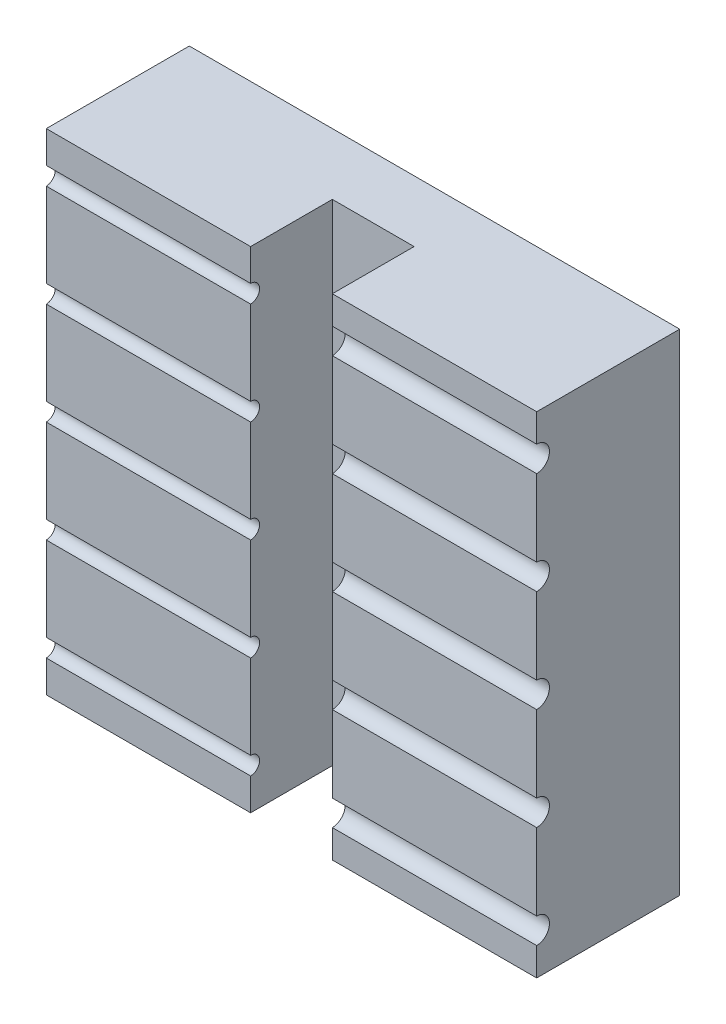
ISO-10303-21;
HEADER;
FILE_DESCRIPTION(('STEP AP214'),'2;1');
FILE_NAME('part.step','',(''),(''),'','','');
FILE_SCHEMA(('AUTOMOTIVE_DESIGN { 1 0 10303 214 1 1 1 1 }'));
ENDSEC;
DATA;
#1=APPLICATION_CONTEXT('core data for automotive mechanical design processes');
#2=APPLICATION_PROTOCOL_DEFINITION('international standard','automotive_design',2000,#1);
#3=PRODUCT_CONTEXT('',#1,'mechanical');
#4=PRODUCT('Part','Part','',(#3));
#5=PRODUCT_RELATED_PRODUCT_CATEGORY('part','',(#4));
#6=PRODUCT_DEFINITION_FORMATION('','',#4);
#7=PRODUCT_DEFINITION_CONTEXT('part definition',#1,'design');
#8=PRODUCT_DEFINITION('design','',#6,#7);
#9=PRODUCT_DEFINITION_SHAPE('','',#8);
#10=(LENGTH_UNIT() NAMED_UNIT(*) SI_UNIT(.MILLI.,.METRE.));
#11=(NAMED_UNIT(*) PLANE_ANGLE_UNIT() SI_UNIT($,.RADIAN.));
#12=(NAMED_UNIT(*) SI_UNIT($,.STERADIAN.) SOLID_ANGLE_UNIT());
#13=UNCERTAINTY_MEASURE_WITH_UNIT(LENGTH_MEASURE(1.E-05),#10,'distance_accuracy_value','');
#14=(GEOMETRIC_REPRESENTATION_CONTEXT(3) GLOBAL_UNCERTAINTY_ASSIGNED_CONTEXT((#13)) GLOBAL_UNIT_ASSIGNED_CONTEXT((#10,
#11,#12)) REPRESENTATION_CONTEXT('',''));
#15=CARTESIAN_POINT('',(0.,0.,0.));
#16=DIRECTION('',(0.,0.,1.));
#17=DIRECTION('',(1.,0.,0.));
#18=AXIS2_PLACEMENT_3D('',#15,#16,#17);
#19=CARTESIAN_POINT('',(0.,0.,14.));
#20=DIRECTION('',(0.,0.,1.));
#21=DIRECTION('',(1.,0.,0.));
#22=AXIS2_PLACEMENT_3D('',#19,#20,#21);
#23=PLANE('',#22);
#24=DIRECTION('',(1.,0.,0.));
#25=VECTOR('',#24,1.);
#26=CARTESIAN_POINT('',(-1.00000000000001,-21.25,14.));
#27=LINE('',#26,#25);
#28=CARTESIAN_POINT('',(4.,-21.25,14.));
#29=VERTEX_POINT('',#28);
#30=CARTESIAN_POINT('',(24.,-21.25,14.));
#31=VERTEX_POINT('',#30);
#32=EDGE_CURVE('E11',#29,#31,#27,.T.);
#33=ORIENTED_EDGE('',*,*,#32,.F.);
#34=DIRECTION('',(0.,1.,0.));
#35=VECTOR('',#34,1.);
#36=CARTESIAN_POINT('',(4.,0.,14.));
#37=LINE('',#36,#35);
#38=CARTESIAN_POINT('',(4.,-24.,14.));
#39=VERTEX_POINT('',#38);
#40=EDGE_CURVE('E391',#39,#29,#37,.T.);
#41=ORIENTED_EDGE('',*,*,#40,.F.);
#42=DIRECTION('',(1.,0.,0.));
#43=VECTOR('',#42,1.);
#44=CARTESIAN_POINT('',(0.,-24.,14.));
#45=LINE('',#44,#43);
#46=CARTESIAN_POINT('',(24.,-24.,14.));
#47=VERTEX_POINT('',#46);
#48=EDGE_CURVE('E260',#39,#47,#45,.T.);
#49=ORIENTED_EDGE('',*,*,#48,.T.);
#50=DIRECTION('',(0.,1.,0.));
#51=VECTOR('',#50,1.);
#52=CARTESIAN_POINT('',(24.,0.,14.));
#53=LINE('',#52,#51);
#54=EDGE_CURVE('E261',#47,#31,#53,.T.);
#55=ORIENTED_EDGE('',*,*,#54,.T.);
#56=EDGE_LOOP('',(#33,#41,#49,#55));
#57=FACE_BOUND('',#56,.T.);
#58=ADVANCED_FACE('F47',(#57),#23,.T.);
#59=DIRECTION('',(1.,0.,0.));
#60=VECTOR('',#59,1.);
#61=CARTESIAN_POINT('',(-1.00000000000001,-1.25,14.));
#62=LINE('',#61,#60);
#63=CARTESIAN_POINT('',(4.,-1.25,14.));
#64=VERTEX_POINT('',#63);
#65=CARTESIAN_POINT('',(24.,-1.25,14.));
#66=VERTEX_POINT('',#65);
#67=EDGE_CURVE('E370',#64,#66,#62,.T.);
#68=ORIENTED_EDGE('',*,*,#67,.F.);
#69=CARTESIAN_POINT('',(4.,-8.75,14.));
#70=VERTEX_POINT('',#69);
#71=EDGE_CURVE('E399',#70,#64,#37,.T.);
#72=ORIENTED_EDGE('',*,*,#71,.F.);
#73=DIRECTION('',(1.,0.,0.));
#74=VECTOR('',#73,1.);
#75=CARTESIAN_POINT('',(-1.00000000000001,-8.75,14.));
#76=LINE('',#75,#74);
#77=CARTESIAN_POINT('',(24.,-8.75,14.));
#78=VERTEX_POINT('',#77);
#79=EDGE_CURVE('E361',#78,#70,#76,.F.);
#80=ORIENTED_EDGE('',*,*,#79,.F.);
#81=EDGE_CURVE('E259',#78,#66,#53,.T.);
#82=ORIENTED_EDGE('',*,*,#81,.T.);
#83=EDGE_LOOP('',(#68,#72,#80,#82));
#84=FACE_BOUND('',#83,.T.);
#85=ADVANCED_FACE('F506',(#84),#23,.T.);
#86=DIRECTION('',(1.,0.,0.));
#87=VECTOR('',#86,1.);
#88=CARTESIAN_POINT('',(-1.00000000000001,-18.75,14.));
#89=LINE('',#88,#87);
#90=CARTESIAN_POINT('',(24.,-18.75,14.));
#91=VERTEX_POINT('',#90);
#92=CARTESIAN_POINT('',(4.,-18.75,14.));
#93=VERTEX_POINT('',#92);
#94=EDGE_CURVE('E56',#91,#93,#89,.F.);
#95=ORIENTED_EDGE('',*,*,#94,.F.);
#96=CARTESIAN_POINT('',(24.,-11.25,14.));
#97=VERTEX_POINT('',#96);
#98=EDGE_CURVE('E267',#91,#97,#53,.T.);
#99=ORIENTED_EDGE('',*,*,#98,.T.);
#100=DIRECTION('',(1.,0.,0.));
#101=VECTOR('',#100,1.);
#102=CARTESIAN_POINT('',(-1.00000000000001,-11.25,14.));
#103=LINE('',#102,#101);
#104=CARTESIAN_POINT('',(4.,-11.25,14.));
#105=VERTEX_POINT('',#104);
#106=EDGE_CURVE('E364',#105,#97,#103,.T.);
#107=ORIENTED_EDGE('',*,*,#106,.F.);
#108=EDGE_CURVE('E389',#93,#105,#37,.T.);
#109=ORIENTED_EDGE('',*,*,#108,.F.);
#110=EDGE_LOOP('',(#95,#99,#107,#109));
#111=FACE_BOUND('',#110,.T.);
#112=ADVANCED_FACE('F397',(#111),#23,.T.);
#113=DIRECTION('',(1.,0.,0.));
#114=VECTOR('',#113,1.);
#115=CARTESIAN_POINT('',(-1.00000000000001,1.25,14.));
#116=LINE('',#115,#114);
#117=CARTESIAN_POINT('',(24.,1.25,14.));
#118=VERTEX_POINT('',#117);
#119=CARTESIAN_POINT('',(4.,1.25,14.));
#120=VERTEX_POINT('',#119);
#121=EDGE_CURVE('E367',#118,#120,#116,.F.);
#122=ORIENTED_EDGE('',*,*,#121,.F.);
#123=CARTESIAN_POINT('',(24.,8.75,14.));
#124=VERTEX_POINT('',#123);
#125=EDGE_CURVE('E254',#118,#124,#53,.T.);
#126=ORIENTED_EDGE('',*,*,#125,.T.);
#127=DIRECTION('',(1.,0.,0.));
#128=VECTOR('',#127,1.);
#129=CARTESIAN_POINT('',(-1.00000000000001,8.75,14.));
#130=LINE('',#129,#128);
#131=CARTESIAN_POINT('',(4.,8.75,14.));
#132=VERTEX_POINT('',#131);
#133=EDGE_CURVE('E358',#132,#124,#130,.T.);
#134=ORIENTED_EDGE('',*,*,#133,.F.);
#135=EDGE_CURVE('E404',#120,#132,#37,.T.);
#136=ORIENTED_EDGE('',*,*,#135,.F.);
#137=EDGE_LOOP('',(#122,#126,#134,#136));
#138=FACE_BOUND('',#137,.T.);
#139=ADVANCED_FACE('F495',(#138),#23,.T.);
#140=DIRECTION('',(1.,0.,0.));
#141=VECTOR('',#140,1.);
#142=CARTESIAN_POINT('',(-1.00000000000001,11.25,14.));
#143=LINE('',#142,#141);
#144=CARTESIAN_POINT('',(24.,11.25,14.));
#145=VERTEX_POINT('',#144);
#146=CARTESIAN_POINT('',(4.,11.25,14.));
#147=VERTEX_POINT('',#146);
#148=EDGE_CURVE('E239',#145,#147,#143,.F.);
#149=ORIENTED_EDGE('',*,*,#148,.F.);
#150=CARTESIAN_POINT('',(24.,18.75,14.));
#151=VERTEX_POINT('',#150);
#152=EDGE_CURVE('E247',#145,#151,#53,.T.);
#153=ORIENTED_EDGE('',*,*,#152,.T.);
#154=DIRECTION('',(1.,0.,0.));
#155=VECTOR('',#154,1.);
#156=CARTESIAN_POINT('',(-1.00000000000001,18.75,14.));
#157=LINE('',#156,#155);
#158=CARTESIAN_POINT('',(4.,18.75,14.));
#159=VERTEX_POINT('',#158);
#160=EDGE_CURVE('E230',#159,#151,#157,.T.);
#161=ORIENTED_EDGE('',*,*,#160,.F.);
#162=EDGE_CURVE('E486',#147,#159,#37,.T.);
#163=ORIENTED_EDGE('',*,*,#162,.F.);
#164=EDGE_LOOP('',(#149,#153,#161,#163));
#165=FACE_BOUND('',#164,.T.);
#166=ADVANCED_FACE('F252',(#165),#23,.T.);
#167=CARTESIAN_POINT('',(0.,0.,14.));
#168=DIRECTION('',(0.,0.,1.));
#169=DIRECTION('',(1.,0.,0.));
#170=AXIS2_PLACEMENT_3D('',#167,#168,#169);
#171=PLANE('',#170);
#172=DIRECTION('',(-1.,0.,0.));
#173=VECTOR('',#172,1.);
#174=CARTESIAN_POINT('',(1.00000000000001,-19.125,14.));
#175=LINE('',#174,#173);
#176=CARTESIAN_POINT('',(-4.,-19.125,14.));
#177=VERTEX_POINT('',#176);
#178=CARTESIAN_POINT('',(-24.,-19.125,14.));
#179=VERTEX_POINT('',#178);
#180=EDGE_CURVE('E351',#177,#179,#175,.T.);
#181=ORIENTED_EDGE('',*,*,#180,.F.);
#182=DIRECTION('',(0.,1.,0.));
#183=VECTOR('',#182,1.);
#184=CARTESIAN_POINT('',(-4.,0.,14.));
#185=LINE('',#184,#183);
#186=CARTESIAN_POINT('',(-4.,-10.875,14.));
#187=VERTEX_POINT('',#186);
#188=EDGE_CURVE('E426',#177,#187,#185,.T.);
#189=ORIENTED_EDGE('',*,*,#188,.T.);
#190=DIRECTION('',(-1.,0.,0.));
#191=VECTOR('',#190,1.);
#192=CARTESIAN_POINT('',(1.00000000000001,-10.875,14.));
#193=LINE('',#192,#191);
#194=CARTESIAN_POINT('',(-24.,-10.875,14.));
#195=VERTEX_POINT('',#194);
#196=EDGE_CURVE('E342',#195,#187,#193,.F.);
#197=ORIENTED_EDGE('',*,*,#196,.F.);
#198=DIRECTION('',(0.,1.,0.));
#199=VECTOR('',#198,1.);
#200=CARTESIAN_POINT('',(-24.,0.,14.));
#201=LINE('',#200,#199);
#202=EDGE_CURVE('E416',#179,#195,#201,.T.);
#203=ORIENTED_EDGE('',*,*,#202,.F.);
#204=EDGE_LOOP('',(#181,#189,#197,#203));
#205=FACE_BOUND('',#204,.T.);
#206=ADVANCED_FACE('F544',(#205),#171,.T.);
#207=DIRECTION('',(-1.,0.,0.));
#208=VECTOR('',#207,1.);
#209=CARTESIAN_POINT('',(1.00000000000001,-9.125,14.));
#210=LINE('',#209,#208);
#211=CARTESIAN_POINT('',(-4.,-9.125,14.));
#212=VERTEX_POINT('',#211);
#213=CARTESIAN_POINT('',(-24.,-9.125,14.));
#214=VERTEX_POINT('',#213);
#215=EDGE_CURVE('E345',#212,#214,#210,.T.);
#216=ORIENTED_EDGE('',*,*,#215,.F.);
#217=CARTESIAN_POINT('',(-4.,-0.875,14.));
#218=VERTEX_POINT('',#217);
#219=EDGE_CURVE('E657',#212,#218,#185,.T.);
#220=ORIENTED_EDGE('',*,*,#219,.T.);
#221=DIRECTION('',(-1.,0.,0.));
#222=VECTOR('',#221,1.);
#223=CARTESIAN_POINT('',(1.00000000000001,-0.875,14.));
#224=LINE('',#223,#222);
#225=CARTESIAN_POINT('',(-24.,-0.875,14.));
#226=VERTEX_POINT('',#225);
#227=EDGE_CURVE('E336',#226,#218,#224,.F.);
#228=ORIENTED_EDGE('',*,*,#227,.F.);
#229=EDGE_CURVE('E677',#214,#226,#201,.T.);
#230=ORIENTED_EDGE('',*,*,#229,.F.);
#231=EDGE_LOOP('',(#216,#220,#228,#230));
#232=FACE_BOUND('',#231,.T.);
#233=ADVANCED_FACE('F550',(#232),#171,.T.);
#234=DIRECTION('',(-1.,0.,0.));
#235=VECTOR('',#234,1.);
#236=CARTESIAN_POINT('',(1.00000000000001,0.875,14.));
#237=LINE('',#236,#235);
#238=CARTESIAN_POINT('',(-4.,0.875,14.));
#239=VERTEX_POINT('',#238);
#240=CARTESIAN_POINT('',(-24.,0.875,14.));
#241=VERTEX_POINT('',#240);
#242=EDGE_CURVE('E339',#239,#241,#237,.T.);
#243=ORIENTED_EDGE('',*,*,#242,.F.);
#244=CARTESIAN_POINT('',(-4.,9.125,14.));
#245=VERTEX_POINT('',#244);
#246=EDGE_CURVE('E652',#239,#245,#185,.T.);
#247=ORIENTED_EDGE('',*,*,#246,.T.);
#248=DIRECTION('',(-1.,0.,0.));
#249=VECTOR('',#248,1.);
#250=CARTESIAN_POINT('',(1.00000000000001,9.125,14.));
#251=LINE('',#250,#249);
#252=CARTESIAN_POINT('',(-24.,9.125,14.));
#253=VERTEX_POINT('',#252);
#254=EDGE_CURVE('E330',#253,#245,#251,.F.);
#255=ORIENTED_EDGE('',*,*,#254,.F.);
#256=EDGE_CURVE('E681',#241,#253,#201,.T.);
#257=ORIENTED_EDGE('',*,*,#256,.F.);
#258=EDGE_LOOP('',(#243,#247,#255,#257));
#259=FACE_BOUND('',#258,.T.);
#260=ADVANCED_FACE('F638',(#259),#171,.T.);
#261=DIRECTION('',(-1.,0.,0.));
#262=VECTOR('',#261,1.);
#263=CARTESIAN_POINT('',(1.00000000000001,10.875,14.));
#264=LINE('',#263,#262);
#265=CARTESIAN_POINT('',(-4.,10.875,14.));
#266=VERTEX_POINT('',#265);
#267=CARTESIAN_POINT('',(-24.,10.875,14.));
#268=VERTEX_POINT('',#267);
#269=EDGE_CURVE('E333',#266,#268,#264,.T.);
#270=ORIENTED_EDGE('',*,*,#269,.F.);
#271=CARTESIAN_POINT('',(-4.,19.125,14.));
#272=VERTEX_POINT('',#271);
#273=EDGE_CURVE('E650',#266,#272,#185,.T.);
#274=ORIENTED_EDGE('',*,*,#273,.T.);
#275=DIRECTION('',(-1.,0.,0.));
#276=VECTOR('',#275,1.);
#277=CARTESIAN_POINT('',(1.00000000000001,19.125,14.));
#278=LINE('',#277,#276);
#279=CARTESIAN_POINT('',(-24.,19.125,14.));
#280=VERTEX_POINT('',#279);
#281=EDGE_CURVE('E324',#280,#272,#278,.F.);
#282=ORIENTED_EDGE('',*,*,#281,.F.);
#283=EDGE_CURVE('E685',#268,#280,#201,.T.);
#284=ORIENTED_EDGE('',*,*,#283,.F.);
#285=EDGE_LOOP('',(#270,#274,#282,#284));
#286=FACE_BOUND('',#285,.T.);
#287=ADVANCED_FACE('F629',(#286),#171,.T.);
#288=DIRECTION('',(-1.,0.,0.));
#289=VECTOR('',#288,1.);
#290=CARTESIAN_POINT('',(1.00000000000001,20.875,14.));
#291=LINE('',#290,#289);
#292=CARTESIAN_POINT('',(-4.,20.875,14.));
#293=VERTEX_POINT('',#292);
#294=CARTESIAN_POINT('',(-24.,20.875,14.));
#295=VERTEX_POINT('',#294);
#296=EDGE_CURVE('E327',#293,#295,#291,.T.);
#297=ORIENTED_EDGE('',*,*,#296,.F.);
#298=CARTESIAN_POINT('',(-4.,24.,14.));
#299=VERTEX_POINT('',#298);
#300=EDGE_CURVE('E427',#293,#299,#185,.T.);
#301=ORIENTED_EDGE('',*,*,#300,.T.);
#302=DIRECTION('',(1.,0.,0.));
#303=VECTOR('',#302,1.);
#304=CARTESIAN_POINT('',(0.,24.,14.));
#305=LINE('',#304,#303);
#306=CARTESIAN_POINT('',(-24.,24.,14.));
#307=VERTEX_POINT('',#306);
#308=EDGE_CURVE('E418',#307,#299,#305,.T.);
#309=ORIENTED_EDGE('',*,*,#308,.F.);
#310=EDGE_CURVE('E417',#295,#307,#201,.T.);
#311=ORIENTED_EDGE('',*,*,#310,.F.);
#312=EDGE_LOOP('',(#297,#301,#309,#311));
#313=FACE_BOUND('',#312,.T.);
#314=ADVANCED_FACE('F623',(#313),#171,.T.);
#315=CARTESIAN_POINT('',(0.,0.,6.));
#316=DIRECTION('',(0.,0.,1.));
#317=DIRECTION('',(1.,0.,0.));
#318=AXIS2_PLACEMENT_3D('',#315,#316,#317);
#319=PLANE('',#318);
#320=DIRECTION('',(1.,0.,0.));
#321=VECTOR('',#320,1.);
#322=CARTESIAN_POINT('',(0.,24.,6.));
#323=LINE('',#322,#321);
#324=CARTESIAN_POINT('',(-4.,24.,6.));
#325=VERTEX_POINT('',#324);
#326=CARTESIAN_POINT('',(4.,24.,6.));
#327=VERTEX_POINT('',#326);
#328=EDGE_CURVE('E293',#325,#327,#323,.T.);
#329=ORIENTED_EDGE('',*,*,#328,.F.);
#330=DIRECTION('',(0.,-1.,0.));
#331=VECTOR('',#330,1.);
#332=CARTESIAN_POINT('',(-4.,0.,6.));
#333=LINE('',#332,#331);
#334=CARTESIAN_POINT('',(-4.,-24.,6.));
#335=VERTEX_POINT('',#334);
#336=EDGE_CURVE('E283',#325,#335,#333,.T.);
#337=ORIENTED_EDGE('',*,*,#336,.T.);
#338=DIRECTION('',(1.,0.,0.));
#339=VECTOR('',#338,1.);
#340=CARTESIAN_POINT('',(0.,-24.,6.));
#341=LINE('',#340,#339);
#342=CARTESIAN_POINT('',(4.,-24.,6.));
#343=VERTEX_POINT('',#342);
#344=EDGE_CURVE('E289',#335,#343,#341,.T.);
#345=ORIENTED_EDGE('',*,*,#344,.T.);
#346=DIRECTION('',(0.,-1.,0.));
#347=VECTOR('',#346,1.);
#348=CARTESIAN_POINT('',(4.,0.,6.));
#349=LINE('',#348,#347);
#350=EDGE_CURVE('E280',#327,#343,#349,.T.);
#351=ORIENTED_EDGE('',*,*,#350,.F.);
#352=EDGE_LOOP('',(#329,#337,#345,#351));
#353=FACE_BOUND('',#352,.T.);
#354=ADVANCED_FACE('F628',(#353),#319,.T.);
#355=CARTESIAN_POINT('',(0.,-24.,6.));
#356=DIRECTION('',(0.,1.,0.));
#357=DIRECTION('',(0.,0.,1.));
#358=AXIS2_PLACEMENT_3D('',#355,#356,#357);
#359=PLANE('',#358);
#360=DIRECTION('',(1.,0.,0.));
#361=VECTOR('',#360,1.);
#362=CARTESIAN_POINT('',(0.,-24.,0.));
#363=LINE('',#362,#361);
#364=CARTESIAN_POINT('',(-24.,-24.,0.));
#365=VERTEX_POINT('',#364);
#366=CARTESIAN_POINT('',(24.,-24.,0.));
#367=VERTEX_POINT('',#366);
#368=EDGE_CURVE('E288',#365,#367,#363,.T.);
#369=ORIENTED_EDGE('',*,*,#368,.T.);
#370=DIRECTION('',(0.,0.,-1.));
#371=VECTOR('',#370,1.);
#372=CARTESIAN_POINT('',(24.,-24.,6.));
#373=LINE('',#372,#371);
#374=EDGE_CURVE('E320',#47,#367,#373,.T.);
#375=ORIENTED_EDGE('',*,*,#374,.F.);
#376=ORIENTED_EDGE('',*,*,#48,.F.);
#377=DIRECTION('',(0.,0.,-1.));
#378=VECTOR('',#377,1.);
#379=CARTESIAN_POINT('',(4.,-24.,14.));
#380=LINE('',#379,#378);
#381=EDGE_CURVE('E275',#39,#343,#380,.T.);
#382=ORIENTED_EDGE('',*,*,#381,.T.);
#383=ORIENTED_EDGE('',*,*,#344,.F.);
#384=DIRECTION('',(0.,0.,-1.));
#385=VECTOR('',#384,1.);
#386=CARTESIAN_POINT('',(-4.,-24.,14.));
#387=LINE('',#386,#385);
#388=CARTESIAN_POINT('',(-4.,-24.,14.));
#389=VERTEX_POINT('',#388);
#390=EDGE_CURVE('E284',#389,#335,#387,.T.);
#391=ORIENTED_EDGE('',*,*,#390,.F.);
#392=DIRECTION('',(1.,0.,0.));
#393=VECTOR('',#392,1.);
#394=CARTESIAN_POINT('',(0.,-24.,14.));
#395=LINE('',#394,#393);
#396=CARTESIAN_POINT('',(-24.,-24.,14.));
#397=VERTEX_POINT('',#396);
#398=EDGE_CURVE('E279',#397,#389,#395,.T.);
#399=ORIENTED_EDGE('',*,*,#398,.F.);
#400=DIRECTION('',(0.,0.,-1.));
#401=VECTOR('',#400,1.);
#402=CARTESIAN_POINT('',(-24.,-24.,6.));
#403=LINE('',#402,#401);
#404=EDGE_CURVE('E298',#397,#365,#403,.T.);
#405=ORIENTED_EDGE('',*,*,#404,.T.);
#406=EDGE_LOOP('',(#369,#375,#376,#382,#383,#391,#399,#405));
#407=FACE_BOUND('',#406,.T.);
#408=ADVANCED_FACE('F49',(#407),#359,.F.);
#409=CARTESIAN_POINT('',(24.,0.,6.));
#410=DIRECTION('',(-1.,0.,0.));
#411=DIRECTION('',(0.,0.,1.));
#412=AXIS2_PLACEMENT_3D('',#409,#410,#411);
#413=PLANE('',#412);
#414=ORIENTED_EDGE('',*,*,#98,.F.);
#415=CARTESIAN_POINT('',(24.,-20.,14.));
#416=DIRECTION('',(1.,0.,0.));
#417=DIRECTION('',(0.,0.,-1.));
#418=AXIS2_PLACEMENT_3D('',#415,#416,#417);
#419=CIRCLE('',#418,1.25);
#420=EDGE_CURVE('E380',#31,#91,#419,.T.);
#421=ORIENTED_EDGE('',*,*,#420,.F.);
#422=ORIENTED_EDGE('',*,*,#54,.F.);
#423=ORIENTED_EDGE('',*,*,#374,.T.);
#424=DIRECTION('',(0.,1.,0.));
#425=VECTOR('',#424,1.);
#426=CARTESIAN_POINT('',(24.,0.,0.));
#427=LINE('',#426,#425);
#428=CARTESIAN_POINT('',(24.,24.,0.));
#429=VERTEX_POINT('',#428);
#430=EDGE_CURVE('E301',#367,#429,#427,.T.);
#431=ORIENTED_EDGE('',*,*,#430,.T.);
#432=DIRECTION('',(0.,0.,-1.));
#433=VECTOR('',#432,1.);
#434=CARTESIAN_POINT('',(24.,24.,6.));
#435=LINE('',#434,#433);
#436=CARTESIAN_POINT('',(24.,24.,14.));
#437=VERTEX_POINT('',#436);
#438=EDGE_CURVE('E316',#437,#429,#435,.T.);
#439=ORIENTED_EDGE('',*,*,#438,.F.);
#440=CARTESIAN_POINT('',(24.,21.25,14.));
#441=VERTEX_POINT('',#440);
#442=EDGE_CURVE('E249',#441,#437,#53,.T.);
#443=ORIENTED_EDGE('',*,*,#442,.F.);
#444=CARTESIAN_POINT('',(24.,20.,14.0000000000001));
#445=DIRECTION('',(1.,0.,0.));
#446=DIRECTION('',(0.,0.,-1.));
#447=AXIS2_PLACEMENT_3D('',#444,#445,#446);
#448=CIRCLE('',#447,1.25);
#449=EDGE_CURVE('E63',#151,#441,#448,.T.);
#450=ORIENTED_EDGE('',*,*,#449,.F.);
#451=ORIENTED_EDGE('',*,*,#152,.F.);
#452=CARTESIAN_POINT('',(24.,10.,14.0000000000001));
#453=DIRECTION('',(1.,0.,0.));
#454=DIRECTION('',(0.,0.,-1.));
#455=AXIS2_PLACEMENT_3D('',#452,#453,#454);
#456=CIRCLE('',#455,1.25);
#457=EDGE_CURVE('E71',#124,#145,#456,.T.);
#458=ORIENTED_EDGE('',*,*,#457,.F.);
#459=ORIENTED_EDGE('',*,*,#125,.F.);
#460=CARTESIAN_POINT('',(24.,0.,14.));
#461=DIRECTION('',(1.,0.,0.));
#462=DIRECTION('',(0.,0.,-1.));
#463=AXIS2_PLACEMENT_3D('',#460,#461,#462);
#464=CIRCLE('',#463,1.25);
#465=EDGE_CURVE('E480',#66,#118,#464,.T.);
#466=ORIENTED_EDGE('',*,*,#465,.F.);
#467=ORIENTED_EDGE('',*,*,#81,.F.);
#468=CARTESIAN_POINT('',(24.,-10.,14.));
#469=DIRECTION('',(1.,0.,0.));
#470=DIRECTION('',(0.,0.,-1.));
#471=AXIS2_PLACEMENT_3D('',#468,#469,#470);
#472=CIRCLE('',#471,1.25);
#473=EDGE_CURVE('E477',#97,#78,#472,.T.);
#474=ORIENTED_EDGE('',*,*,#473,.F.);
#475=EDGE_LOOP('',(#414,#421,#422,#423,#431,#439,#443,#450,#451,#458,#459,#466,#467,#474));
#476=FACE_BOUND('',#475,.T.);
#477=ADVANCED_FACE('F246',(#476),#413,.F.);
#478=CARTESIAN_POINT('',(0.,24.,6.));
#479=DIRECTION('',(0.,1.,0.));
#480=DIRECTION('',(0.,0.,1.));
#481=AXIS2_PLACEMENT_3D('',#478,#479,#480);
#482=PLANE('',#481);
#483=DIRECTION('',(0.,0.,-1.));
#484=VECTOR('',#483,1.);
#485=CARTESIAN_POINT('',(-4.,24.,14.));
#486=LINE('',#485,#484);
#487=EDGE_CURVE('E408',#299,#325,#486,.T.);
#488=ORIENTED_EDGE('',*,*,#487,.T.);
#489=ORIENTED_EDGE('',*,*,#328,.T.);
#490=DIRECTION('',(0.,0.,-1.));
#491=VECTOR('',#490,1.);
#492=CARTESIAN_POINT('',(4.,24.,14.));
#493=LINE('',#492,#491);
#494=CARTESIAN_POINT('',(4.,24.,14.));
#495=VERTEX_POINT('',#494);
#496=EDGE_CURVE('E272',#495,#327,#493,.T.);
#497=ORIENTED_EDGE('',*,*,#496,.F.);
#498=DIRECTION('',(1.,0.,0.));
#499=VECTOR('',#498,1.);
#500=CARTESIAN_POINT('',(0.,24.,14.));
#501=LINE('',#500,#499);
#502=EDGE_CURVE('E266',#495,#437,#501,.T.);
#503=ORIENTED_EDGE('',*,*,#502,.T.);
#504=ORIENTED_EDGE('',*,*,#438,.T.);
#505=DIRECTION('',(1.,0.,0.));
#506=VECTOR('',#505,1.);
#507=CARTESIAN_POINT('',(0.,24.,0.));
#508=LINE('',#507,#506);
#509=CARTESIAN_POINT('',(-24.,24.,0.));
#510=VERTEX_POINT('',#509);
#511=EDGE_CURVE('E305',#510,#429,#508,.T.);
#512=ORIENTED_EDGE('',*,*,#511,.F.);
#513=DIRECTION('',(0.,0.,-1.));
#514=VECTOR('',#513,1.);
#515=CARTESIAN_POINT('',(-24.,24.,6.));
#516=LINE('',#515,#514);
#517=EDGE_CURVE('E313',#307,#510,#516,.T.);
#518=ORIENTED_EDGE('',*,*,#517,.F.);
#519=ORIENTED_EDGE('',*,*,#308,.T.);
#520=EDGE_LOOP('',(#488,#489,#497,#503,#504,#512,#518,#519));
#521=FACE_BOUND('',#520,.T.);
#522=ADVANCED_FACE('F698',(#521),#482,.T.);
#523=CARTESIAN_POINT('',(-24.,0.,6.));
#524=DIRECTION('',(-1.,0.,0.));
#525=DIRECTION('',(0.,0.,1.));
#526=AXIS2_PLACEMENT_3D('',#523,#524,#525);
#527=PLANE('',#526);
#528=CARTESIAN_POINT('',(-24.,-20.,14.));
#529=DIRECTION('',(-1.,0.,0.));
#530=DIRECTION('',(0.,0.,1.));
#531=AXIS2_PLACEMENT_3D('',#528,#529,#530);
#532=CIRCLE('',#531,0.875);
#533=CARTESIAN_POINT('',(-24.,-20.875,14.));
#534=VERTEX_POINT('',#533);
#535=EDGE_CURVE('E451',#179,#534,#532,.T.);
#536=ORIENTED_EDGE('',*,*,#535,.F.);
#537=ORIENTED_EDGE('',*,*,#202,.T.);
#538=CARTESIAN_POINT('',(-24.,-10.,14.));
#539=DIRECTION('',(-1.,0.,0.));
#540=DIRECTION('',(0.,0.,1.));
#541=AXIS2_PLACEMENT_3D('',#538,#539,#540);
#542=CIRCLE('',#541,0.875);
#543=EDGE_CURVE('E460',#214,#195,#542,.T.);
#544=ORIENTED_EDGE('',*,*,#543,.F.);
#545=ORIENTED_EDGE('',*,*,#229,.T.);
#546=CARTESIAN_POINT('',(-24.,0.,14.));
#547=DIRECTION('',(-1.,0.,0.));
#548=DIRECTION('',(0.,0.,1.));
#549=AXIS2_PLACEMENT_3D('',#546,#547,#548);
#550=CIRCLE('',#549,0.875);
#551=EDGE_CURVE('E457',#241,#226,#550,.T.);
#552=ORIENTED_EDGE('',*,*,#551,.F.);
#553=ORIENTED_EDGE('',*,*,#256,.T.);
#554=CARTESIAN_POINT('',(-24.,10.,14.));
#555=DIRECTION('',(-1.,0.,0.));
#556=DIRECTION('',(0.,0.,1.));
#557=AXIS2_PLACEMENT_3D('',#554,#555,#556);
#558=CIRCLE('',#557,0.875);
#559=EDGE_CURVE('E454',#268,#253,#558,.T.);
#560=ORIENTED_EDGE('',*,*,#559,.F.);
#561=ORIENTED_EDGE('',*,*,#283,.T.);
#562=CARTESIAN_POINT('',(-24.,20.,14.));
#563=DIRECTION('',(-1.,0.,0.));
#564=DIRECTION('',(0.,0.,1.));
#565=AXIS2_PLACEMENT_3D('',#562,#563,#564);
#566=CIRCLE('',#565,0.875);
#567=EDGE_CURVE('E393',#295,#280,#566,.T.);
#568=ORIENTED_EDGE('',*,*,#567,.F.);
#569=ORIENTED_EDGE('',*,*,#310,.T.);
#570=ORIENTED_EDGE('',*,*,#517,.T.);
#571=DIRECTION('',(0.,1.,0.));
#572=VECTOR('',#571,1.);
#573=CARTESIAN_POINT('',(-24.,0.,0.));
#574=LINE('',#573,#572);
#575=EDGE_CURVE('E294',#365,#510,#574,.T.);
#576=ORIENTED_EDGE('',*,*,#575,.F.);
#577=ORIENTED_EDGE('',*,*,#404,.F.);
#578=EDGE_CURVE('E412',#397,#534,#201,.T.);
#579=ORIENTED_EDGE('',*,*,#578,.T.);
#580=EDGE_LOOP('',(#536,#537,#544,#545,#552,#553,#560,#561,#568,#569,#570,#576,#577,#579));
#581=FACE_BOUND('',#580,.T.);
#582=ADVANCED_FACE('F694',(#581),#527,.T.);
#583=CARTESIAN_POINT('',(0.,0.,0.));
#584=DIRECTION('',(0.,0.,1.));
#585=DIRECTION('',(1.,0.,0.));
#586=AXIS2_PLACEMENT_3D('',#583,#584,#585);
#587=PLANE('',#586);
#588=ORIENTED_EDGE('',*,*,#511,.T.);
#589=ORIENTED_EDGE('',*,*,#430,.F.);
#590=ORIENTED_EDGE('',*,*,#368,.F.);
#591=ORIENTED_EDGE('',*,*,#575,.T.);
#592=EDGE_LOOP('',(#588,#589,#590,#591));
#593=FACE_BOUND('',#592,.T.);
#594=ADVANCED_FACE('F542',(#593),#587,.F.);
#595=CARTESIAN_POINT('',(4.,0.,14.));
#596=DIRECTION('',(-1.,0.,0.));
#597=DIRECTION('',(0.,0.,1.));
#598=AXIS2_PLACEMENT_3D('',#595,#596,#597);
#599=PLANE('',#598);
#600=CARTESIAN_POINT('',(4.,-20.,14.));
#601=DIRECTION('',(-1.,0.,0.));
#602=DIRECTION('',(0.,0.,1.));
#603=AXIS2_PLACEMENT_3D('',#600,#601,#602);
#604=CIRCLE('',#603,1.25);
#605=EDGE_CURVE('E377',#93,#29,#604,.T.);
#606=ORIENTED_EDGE('',*,*,#605,.F.);
#607=ORIENTED_EDGE('',*,*,#108,.T.);
#608=CARTESIAN_POINT('',(4.,-10.,14.));
#609=DIRECTION('',(-1.,0.,0.));
#610=DIRECTION('',(0.,0.,1.));
#611=AXIS2_PLACEMENT_3D('',#608,#609,#610);
#612=CIRCLE('',#611,1.25);
#613=EDGE_CURVE('E467',#70,#105,#612,.T.);
#614=ORIENTED_EDGE('',*,*,#613,.F.);
#615=ORIENTED_EDGE('',*,*,#71,.T.);
#616=CARTESIAN_POINT('',(4.,0.,14.));
#617=DIRECTION('',(-1.,0.,0.));
#618=DIRECTION('',(0.,0.,1.));
#619=AXIS2_PLACEMENT_3D('',#616,#617,#618);
#620=CIRCLE('',#619,1.25);
#621=EDGE_CURVE('E394',#120,#64,#620,.T.);
#622=ORIENTED_EDGE('',*,*,#621,.F.);
#623=ORIENTED_EDGE('',*,*,#135,.T.);
#624=CARTESIAN_POINT('',(4.,10.,14.0000000000001));
#625=DIRECTION('',(-1.,0.,0.));
#626=DIRECTION('',(0.,0.,1.));
#627=AXIS2_PLACEMENT_3D('',#624,#625,#626);
#628=CIRCLE('',#627,1.25);
#629=EDGE_CURVE('E470',#147,#132,#628,.T.);
#630=ORIENTED_EDGE('',*,*,#629,.F.);
#631=ORIENTED_EDGE('',*,*,#162,.T.);
#632=CARTESIAN_POINT('',(4.,20.,14.0000000000001));
#633=DIRECTION('',(-1.,0.,0.));
#634=DIRECTION('',(0.,0.,1.));
#635=AXIS2_PLACEMENT_3D('',#632,#633,#634);
#636=CIRCLE('',#635,1.25);
#637=CARTESIAN_POINT('',(4.,21.25,14.));
#638=VERTEX_POINT('',#637);
#639=EDGE_CURVE('E233',#638,#159,#636,.T.);
#640=ORIENTED_EDGE('',*,*,#639,.F.);
#641=EDGE_CURVE('E402',#638,#495,#37,.T.);
#642=ORIENTED_EDGE('',*,*,#641,.T.);
#643=ORIENTED_EDGE('',*,*,#496,.T.);
#644=ORIENTED_EDGE('',*,*,#350,.T.);
#645=ORIENTED_EDGE('',*,*,#381,.F.);
#646=ORIENTED_EDGE('',*,*,#40,.T.);
#647=EDGE_LOOP('',(#606,#607,#614,#615,#622,#623,#630,#631,#640,#642,#643,#644,#645,#646));
#648=FACE_BOUND('',#647,.T.);
#649=ADVANCED_FACE('F387',(#648),#599,.T.);
#650=DIRECTION('',(1.,0.,0.));
#651=VECTOR('',#650,1.);
#652=CARTESIAN_POINT('',(-1.00000000000001,21.25,14.));
#653=LINE('',#652,#651);
#654=EDGE_CURVE('E240',#441,#638,#653,.F.);
#655=ORIENTED_EDGE('',*,*,#654,.F.);
#656=ORIENTED_EDGE('',*,*,#442,.T.);
#657=ORIENTED_EDGE('',*,*,#502,.F.);
#658=ORIENTED_EDGE('',*,*,#641,.F.);
#659=EDGE_LOOP('',(#655,#656,#657,#658));
#660=FACE_BOUND('',#659,.T.);
#661=ADVANCED_FACE('F525',(#660),#23,.T.);
#662=CARTESIAN_POINT('',(-4.,0.,14.));
#663=DIRECTION('',(-1.,0.,0.));
#664=DIRECTION('',(0.,0.,1.));
#665=AXIS2_PLACEMENT_3D('',#662,#663,#664);
#666=PLANE('',#665);
#667=ORIENTED_EDGE('',*,*,#188,.F.);
#668=CARTESIAN_POINT('',(-4.,-20.,14.));
#669=DIRECTION('',(-1.,0.,0.));
#670=DIRECTION('',(0.,0.,1.));
#671=AXIS2_PLACEMENT_3D('',#668,#669,#670);
#672=CIRCLE('',#671,0.875);
#673=CARTESIAN_POINT('',(-4.,-20.875,14.));
#674=VERTEX_POINT('',#673);
#675=EDGE_CURVE('E431',#177,#674,#672,.T.);
#676=ORIENTED_EDGE('',*,*,#675,.T.);
#677=EDGE_CURVE('E422',#389,#674,#185,.T.);
#678=ORIENTED_EDGE('',*,*,#677,.F.);
#679=ORIENTED_EDGE('',*,*,#390,.T.);
#680=ORIENTED_EDGE('',*,*,#336,.F.);
#681=ORIENTED_EDGE('',*,*,#487,.F.);
#682=ORIENTED_EDGE('',*,*,#300,.F.);
#683=CARTESIAN_POINT('',(-4.,20.,14.));
#684=DIRECTION('',(-1.,0.,0.));
#685=DIRECTION('',(0.,0.,1.));
#686=AXIS2_PLACEMENT_3D('',#683,#684,#685);
#687=CIRCLE('',#686,0.875);
#688=EDGE_CURVE('E447',#293,#272,#687,.T.);
#689=ORIENTED_EDGE('',*,*,#688,.T.);
#690=ORIENTED_EDGE('',*,*,#273,.F.);
#691=CARTESIAN_POINT('',(-4.,10.,14.));
#692=DIRECTION('',(-1.,0.,0.));
#693=DIRECTION('',(0.,0.,1.));
#694=AXIS2_PLACEMENT_3D('',#691,#692,#693);
#695=CIRCLE('',#694,0.875);
#696=EDGE_CURVE('E443',#266,#245,#695,.T.);
#697=ORIENTED_EDGE('',*,*,#696,.T.);
#698=ORIENTED_EDGE('',*,*,#246,.F.);
#699=CARTESIAN_POINT('',(-4.,0.,14.));
#700=DIRECTION('',(-1.,0.,0.));
#701=DIRECTION('',(0.,0.,1.));
#702=AXIS2_PLACEMENT_3D('',#699,#700,#701);
#703=CIRCLE('',#702,0.875);
#704=EDGE_CURVE('E439',#239,#218,#703,.T.);
#705=ORIENTED_EDGE('',*,*,#704,.T.);
#706=ORIENTED_EDGE('',*,*,#219,.F.);
#707=CARTESIAN_POINT('',(-4.,-10.,14.));
#708=DIRECTION('',(-1.,0.,0.));
#709=DIRECTION('',(0.,0.,1.));
#710=AXIS2_PLACEMENT_3D('',#707,#708,#709);
#711=CIRCLE('',#710,0.875);
#712=EDGE_CURVE('E435',#212,#187,#711,.T.);
#713=ORIENTED_EDGE('',*,*,#712,.T.);
#714=EDGE_LOOP('',(#667,#676,#678,#679,#680,#681,#682,#689,#690,#697,#698,#705,#706,#713));
#715=FACE_BOUND('',#714,.T.);
#716=ADVANCED_FACE('F533',(#715),#666,.F.);
#717=DIRECTION('',(-1.,0.,0.));
#718=VECTOR('',#717,1.);
#719=CARTESIAN_POINT('',(1.00000000000001,-20.875,14.));
#720=LINE('',#719,#718);
#721=EDGE_CURVE('E348',#534,#674,#720,.F.);
#722=ORIENTED_EDGE('',*,*,#721,.F.);
#723=ORIENTED_EDGE('',*,*,#578,.F.);
#724=ORIENTED_EDGE('',*,*,#398,.T.);
#725=ORIENTED_EDGE('',*,*,#677,.T.);
#726=EDGE_LOOP('',(#722,#723,#724,#725));
#727=FACE_BOUND('',#726,.T.);
#728=ADVANCED_FACE('F540',(#727),#171,.T.);
#729=CARTESIAN_POINT('',(1.00000000000001,20.,14.));
#730=DIRECTION('',(-1.,0.,0.));
#731=DIRECTION('',(0.,0.,1.));
#732=AXIS2_PLACEMENT_3D('',#729,#730,#731);
#733=CYLINDRICAL_SURFACE('',#732,0.875);
#734=ORIENTED_EDGE('',*,*,#296,.T.);
#735=ORIENTED_EDGE('',*,*,#567,.T.);
#736=ORIENTED_EDGE('',*,*,#281,.T.);
#737=ORIENTED_EDGE('',*,*,#688,.F.);
#738=EDGE_LOOP('',(#734,#735,#736,#737));
#739=FACE_BOUND('',#738,.T.);
#740=ADVANCED_FACE('F617',(#739),#733,.F.);
#741=CARTESIAN_POINT('',(1.00000000000001,10.,14.));
#742=DIRECTION('',(-1.,0.,0.));
#743=DIRECTION('',(0.,0.,1.));
#744=AXIS2_PLACEMENT_3D('',#741,#742,#743);
#745=CYLINDRICAL_SURFACE('',#744,0.875);
#746=ORIENTED_EDGE('',*,*,#269,.T.);
#747=ORIENTED_EDGE('',*,*,#559,.T.);
#748=ORIENTED_EDGE('',*,*,#254,.T.);
#749=ORIENTED_EDGE('',*,*,#696,.F.);
#750=EDGE_LOOP('',(#746,#747,#748,#749));
#751=FACE_BOUND('',#750,.T.);
#752=ADVANCED_FACE('F613',(#751),#745,.F.);
#753=CARTESIAN_POINT('',(1.00000000000001,0.,14.));
#754=DIRECTION('',(-1.,0.,0.));
#755=DIRECTION('',(0.,0.,1.));
#756=AXIS2_PLACEMENT_3D('',#753,#754,#755);
#757=CYLINDRICAL_SURFACE('',#756,0.875);
#758=ORIENTED_EDGE('',*,*,#242,.T.);
#759=ORIENTED_EDGE('',*,*,#551,.T.);
#760=ORIENTED_EDGE('',*,*,#227,.T.);
#761=ORIENTED_EDGE('',*,*,#704,.F.);
#762=EDGE_LOOP('',(#758,#759,#760,#761));
#763=FACE_BOUND('',#762,.T.);
#764=ADVANCED_FACE('F609',(#763),#757,.F.);
#765=CARTESIAN_POINT('',(1.00000000000001,-10.,14.));
#766=DIRECTION('',(-1.,0.,0.));
#767=DIRECTION('',(0.,0.,1.));
#768=AXIS2_PLACEMENT_3D('',#765,#766,#767);
#769=CYLINDRICAL_SURFACE('',#768,0.875);
#770=ORIENTED_EDGE('',*,*,#215,.T.);
#771=ORIENTED_EDGE('',*,*,#543,.T.);
#772=ORIENTED_EDGE('',*,*,#196,.T.);
#773=ORIENTED_EDGE('',*,*,#712,.F.);
#774=EDGE_LOOP('',(#770,#771,#772,#773));
#775=FACE_BOUND('',#774,.T.);
#776=ADVANCED_FACE('F603',(#775),#769,.F.);
#777=CARTESIAN_POINT('',(1.00000000000001,-20.,14.));
#778=DIRECTION('',(-1.,0.,0.));
#779=DIRECTION('',(0.,0.,1.));
#780=AXIS2_PLACEMENT_3D('',#777,#778,#779);
#781=CYLINDRICAL_SURFACE('',#780,0.875);
#782=ORIENTED_EDGE('',*,*,#180,.T.);
#783=ORIENTED_EDGE('',*,*,#535,.T.);
#784=ORIENTED_EDGE('',*,*,#721,.T.);
#785=ORIENTED_EDGE('',*,*,#675,.F.);
#786=EDGE_LOOP('',(#782,#783,#784,#785));
#787=FACE_BOUND('',#786,.T.);
#788=ADVANCED_FACE('F575',(#787),#781,.F.);
#789=CARTESIAN_POINT('',(-1.00000000000001,20.,14.0000000000001));
#790=DIRECTION('',(1.,0.,0.));
#791=DIRECTION('',(0.,0.,-1.));
#792=AXIS2_PLACEMENT_3D('',#789,#790,#791);
#793=CYLINDRICAL_SURFACE('',#792,1.25);
#794=ORIENTED_EDGE('',*,*,#160,.T.);
#795=ORIENTED_EDGE('',*,*,#449,.T.);
#796=ORIENTED_EDGE('',*,*,#654,.T.);
#797=ORIENTED_EDGE('',*,*,#639,.T.);
#798=EDGE_LOOP('',(#794,#795,#796,#797));
#799=FACE_BOUND('',#798,.T.);
#800=ADVANCED_FACE('F231',(#799),#793,.F.);
#801=CARTESIAN_POINT('',(-1.00000000000001,10.,14.0000000000001));
#802=DIRECTION('',(1.,0.,0.));
#803=DIRECTION('',(0.,0.,-1.));
#804=AXIS2_PLACEMENT_3D('',#801,#802,#803);
#805=CYLINDRICAL_SURFACE('',#804,1.25);
#806=ORIENTED_EDGE('',*,*,#133,.T.);
#807=ORIENTED_EDGE('',*,*,#457,.T.);
#808=ORIENTED_EDGE('',*,*,#148,.T.);
#809=ORIENTED_EDGE('',*,*,#629,.T.);
#810=EDGE_LOOP('',(#806,#807,#808,#809));
#811=FACE_BOUND('',#810,.T.);
#812=ADVANCED_FACE('F497',(#811),#805,.F.);
#813=CARTESIAN_POINT('',(-1.00000000000001,-10.,14.));
#814=DIRECTION('',(1.,0.,0.));
#815=DIRECTION('',(0.,0.,-1.));
#816=AXIS2_PLACEMENT_3D('',#813,#814,#815);
#817=CYLINDRICAL_SURFACE('',#816,1.25);
#818=ORIENTED_EDGE('',*,*,#106,.T.);
#819=ORIENTED_EDGE('',*,*,#473,.T.);
#820=ORIENTED_EDGE('',*,*,#79,.T.);
#821=ORIENTED_EDGE('',*,*,#613,.T.);
#822=EDGE_LOOP('',(#818,#819,#820,#821));
#823=FACE_BOUND('',#822,.T.);
#824=ADVANCED_FACE('F512',(#823),#817,.F.);
#825=CARTESIAN_POINT('',(-1.00000000000001,0.,14.));
#826=DIRECTION('',(1.,0.,0.));
#827=DIRECTION('',(0.,0.,-1.));
#828=AXIS2_PLACEMENT_3D('',#825,#826,#827);
#829=CYLINDRICAL_SURFACE('',#828,1.25);
#830=ORIENTED_EDGE('',*,*,#67,.T.);
#831=ORIENTED_EDGE('',*,*,#465,.T.);
#832=ORIENTED_EDGE('',*,*,#121,.T.);
#833=ORIENTED_EDGE('',*,*,#621,.T.);
#834=EDGE_LOOP('',(#830,#831,#832,#833));
#835=FACE_BOUND('',#834,.T.);
#836=ADVANCED_FACE('F514',(#835),#829,.F.);
#837=CARTESIAN_POINT('',(-1.00000000000001,-20.,14.));
#838=DIRECTION('',(1.,0.,0.));
#839=DIRECTION('',(0.,0.,-1.));
#840=AXIS2_PLACEMENT_3D('',#837,#838,#839);
#841=CYLINDRICAL_SURFACE('',#840,1.25);
#842=ORIENTED_EDGE('',*,*,#32,.T.);
#843=ORIENTED_EDGE('',*,*,#420,.T.);
#844=ORIENTED_EDGE('',*,*,#94,.T.);
#845=ORIENTED_EDGE('',*,*,#605,.T.);
#846=EDGE_LOOP('',(#842,#843,#844,#845));
#847=FACE_BOUND('',#846,.T.);
#848=ADVANCED_FACE('F376',(#847),#841,.F.);
#849=CLOSED_SHELL('',(#58,#85,#112,#139,#166,#206,#233,#260,#287,#314,#354,#408,#477,#522,#582,
#594,#649,#661,#716,#728,#740,#752,#764,#776,#788,#800,#812,#824,#836,#848));
#850=MANIFOLD_SOLID_BREP('B2',#849);
#851=ADVANCED_BREP_SHAPE_REPRESENTATION('',(#18,#850),#14);
#852=SHAPE_DEFINITION_REPRESENTATION(#9,#851);
ENDSEC;
END-ISO-10303-21;
